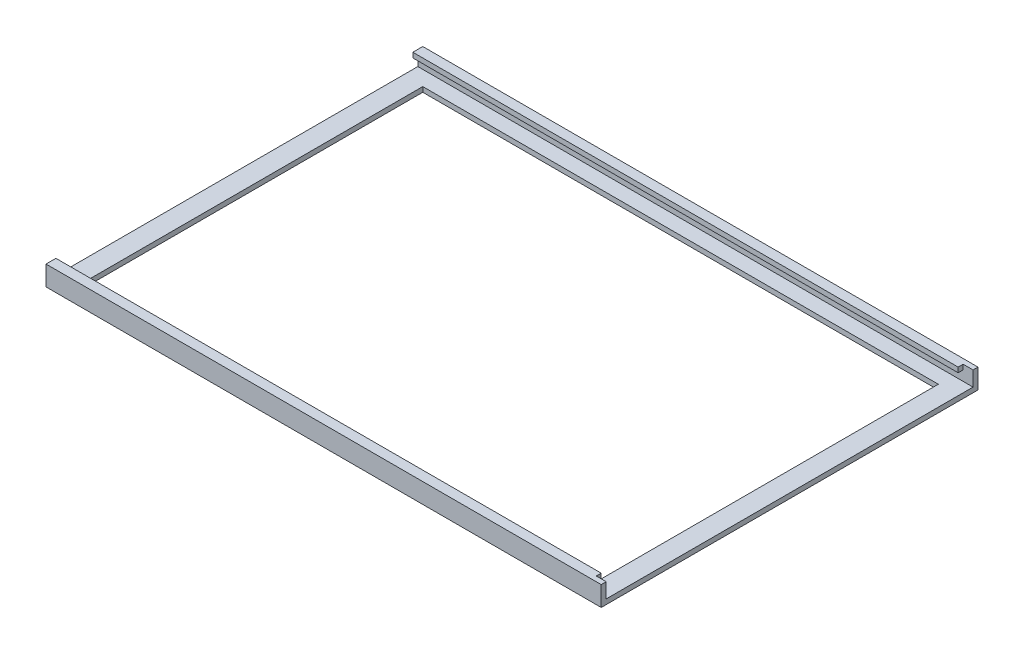
ISO-10303-21;
HEADER;
FILE_DESCRIPTION(('STEP AP214'),'2;1');
FILE_NAME('part.step','',(''),(''),'','','');
FILE_SCHEMA(('AUTOMOTIVE_DESIGN { 1 0 10303 214 1 1 1 1 }'));
ENDSEC;
DATA;
#1=APPLICATION_CONTEXT('core data for automotive mechanical design processes');
#2=APPLICATION_PROTOCOL_DEFINITION('international standard','automotive_design',2000,#1);
#3=PRODUCT_CONTEXT('',#1,'mechanical');
#4=PRODUCT('Part','Part','',(#3));
#5=PRODUCT_RELATED_PRODUCT_CATEGORY('part','',(#4));
#6=PRODUCT_DEFINITION_FORMATION('','',#4);
#7=PRODUCT_DEFINITION_CONTEXT('part definition',#1,'design');
#8=PRODUCT_DEFINITION('design','',#6,#7);
#9=PRODUCT_DEFINITION_SHAPE('','',#8);
#10=(LENGTH_UNIT() NAMED_UNIT(*) SI_UNIT(.MILLI.,.METRE.));
#11=(NAMED_UNIT(*) PLANE_ANGLE_UNIT() SI_UNIT($,.RADIAN.));
#12=(NAMED_UNIT(*) SI_UNIT($,.STERADIAN.) SOLID_ANGLE_UNIT());
#13=UNCERTAINTY_MEASURE_WITH_UNIT(LENGTH_MEASURE(1.E-05),#10,'distance_accuracy_value','');
#14=(GEOMETRIC_REPRESENTATION_CONTEXT(3) GLOBAL_UNCERTAINTY_ASSIGNED_CONTEXT((#13)) GLOBAL_UNIT_ASSIGNED_CONTEXT((#10,
#11,#12)) REPRESENTATION_CONTEXT('',''));
#15=CARTESIAN_POINT('',(0.,0.,0.));
#16=DIRECTION('',(0.,0.,1.));
#17=DIRECTION('',(1.,0.,0.));
#18=AXIS2_PLACEMENT_3D('',#15,#16,#17);
#19=CARTESIAN_POINT('',(112.,4.,-75.));
#20=DIRECTION('',(0.,0.,1.));
#21=DIRECTION('',(1.,0.,0.));
#22=AXIS2_PLACEMENT_3D('',#19,#20,#21);
#23=PLANE('',#22);
#24=DIRECTION('',(0.,1.,0.));
#25=VECTOR('',#24,1.);
#26=CARTESIAN_POINT('',(110.,3.,-75.));
#27=LINE('',#26,#25);
#28=CARTESIAN_POINT('',(110.,3.,-75.));
#29=VERTEX_POINT('',#28);
#30=CARTESIAN_POINT('',(110.,4.,-75.));
#31=VERTEX_POINT('',#30);
#32=EDGE_CURVE('E79',#29,#31,#27,.T.);
#33=ORIENTED_EDGE('',*,*,#32,.F.);
#34=DIRECTION('',(1.,0.,0.));
#35=VECTOR('',#34,1.);
#36=CARTESIAN_POINT('',(0.,3.,-75.));
#37=LINE('',#36,#35);
#38=CARTESIAN_POINT('',(0.,3.,-75.));
#39=VERTEX_POINT('',#38);
#40=EDGE_CURVE('E83',#39,#29,#37,.T.);
#41=ORIENTED_EDGE('',*,*,#40,.F.);
#42=DIRECTION('',(0.,-1.,0.));
#43=VECTOR('',#42,1.);
#44=CARTESIAN_POINT('',(0.,4.,-75.));
#45=LINE('',#44,#43);
#46=CARTESIAN_POINT('',(0.,1.,-75.));
#47=VERTEX_POINT('',#46);
#48=EDGE_CURVE('E263',#39,#47,#45,.T.);
#49=ORIENTED_EDGE('',*,*,#48,.T.);
#50=DIRECTION('',(-1.,0.,0.));
#51=VECTOR('',#50,1.);
#52=CARTESIAN_POINT('',(112.,1.,-75.));
#53=LINE('',#52,#51);
#54=CARTESIAN_POINT('',(112.,1.,-75.));
#55=VERTEX_POINT('',#54);
#56=EDGE_CURVE('E277',#55,#47,#53,.T.);
#57=ORIENTED_EDGE('',*,*,#56,.F.);
#58=DIRECTION('',(0.,-1.,0.));
#59=VECTOR('',#58,1.);
#60=CARTESIAN_POINT('',(112.,4.,-75.));
#61=LINE('',#60,#59);
#62=CARTESIAN_POINT('',(112.,4.,-75.));
#63=VERTEX_POINT('',#62);
#64=EDGE_CURVE('E271',#63,#55,#61,.T.);
#65=ORIENTED_EDGE('',*,*,#64,.F.);
#66=DIRECTION('',(-1.,0.,0.));
#67=VECTOR('',#66,1.);
#68=CARTESIAN_POINT('',(112.,4.,-75.));
#69=LINE('',#68,#67);
#70=EDGE_CURVE('E199',#63,#31,#69,.T.);
#71=ORIENTED_EDGE('',*,*,#70,.T.);
#72=EDGE_LOOP('',(#33,#41,#49,#57,#65,#71));
#73=FACE_BOUND('',#72,.T.);
#74=ADVANCED_FACE('F63',(#73),#23,.T.);
#75=CARTESIAN_POINT('',(0.,1.,0.));
#76=DIRECTION('',(0.,1.,0.));
#77=DIRECTION('',(0.,0.,1.));
#78=AXIS2_PLACEMENT_3D('',#75,#76,#77);
#79=PLANE('',#78);
#80=ORIENTED_EDGE('',*,*,#56,.T.);
#81=DIRECTION('',(0.,0.,1.));
#82=VECTOR('',#81,1.);
#83=CARTESIAN_POINT('',(0.,1.,-76.));
#84=LINE('',#83,#82);
#85=CARTESIAN_POINT('',(0.,1.,-1.));
#86=VERTEX_POINT('',#85);
#87=EDGE_CURVE('E358',#47,#86,#84,.T.);
#88=ORIENTED_EDGE('',*,*,#87,.T.);
#89=DIRECTION('',(1.,0.,0.));
#90=VECTOR('',#89,1.);
#91=CARTESIAN_POINT('',(0.,1.,-1.));
#92=LINE('',#91,#90);
#93=CARTESIAN_POINT('',(112.,1.,-1.));
#94=VERTEX_POINT('',#93);
#95=EDGE_CURVE('E281',#86,#94,#92,.T.);
#96=ORIENTED_EDGE('',*,*,#95,.T.);
#97=DIRECTION('',(0.,0.,-1.));
#98=VECTOR('',#97,1.);
#99=CARTESIAN_POINT('',(112.,1.,0.));
#100=LINE('',#99,#98);
#101=EDGE_CURVE('E362',#94,#55,#100,.T.);
#102=ORIENTED_EDGE('',*,*,#101,.T.);
#103=EDGE_LOOP('',(#80,#88,#96,#102));
#104=FACE_BOUND('',#103,.T.);
#105=DIRECTION('',(-1.,0.,0.));
#106=VECTOR('',#105,1.);
#107=CARTESIAN_POINT('',(108.,1.,-4.));
#108=LINE('',#107,#106);
#109=CARTESIAN_POINT('',(108.,1.,-4.));
#110=VERTEX_POINT('',#109);
#111=CARTESIAN_POINT('',(4.,1.,-3.99999999999999));
#112=VERTEX_POINT('',#111);
#113=EDGE_CURVE('E314',#110,#112,#108,.T.);
#114=ORIENTED_EDGE('',*,*,#113,.T.);
#115=DIRECTION('',(0.,0.,-1.));
#116=VECTOR('',#115,1.);
#117=CARTESIAN_POINT('',(4.,1.,-3.99999999999999));
#118=LINE('',#117,#116);
#119=CARTESIAN_POINT('',(4.00000000000001,1.,-72.));
#120=VERTEX_POINT('',#119);
#121=EDGE_CURVE('E318',#112,#120,#118,.T.);
#122=ORIENTED_EDGE('',*,*,#121,.T.);
#123=DIRECTION('',(1.,0.,0.));
#124=VECTOR('',#123,1.);
#125=CARTESIAN_POINT('',(4.00000000000001,1.,-72.));
#126=LINE('',#125,#124);
#127=CARTESIAN_POINT('',(108.,1.,-72.));
#128=VERTEX_POINT('',#127);
#129=EDGE_CURVE('E323',#120,#128,#126,.T.);
#130=ORIENTED_EDGE('',*,*,#129,.T.);
#131=DIRECTION('',(0.,0.,1.));
#132=VECTOR('',#131,1.);
#133=CARTESIAN_POINT('',(108.,1.,-72.));
#134=LINE('',#133,#132);
#135=EDGE_CURVE('E327',#128,#110,#134,.T.);
#136=ORIENTED_EDGE('',*,*,#135,.T.);
#137=EDGE_LOOP('',(#114,#122,#130,#136));
#138=FACE_BOUND('',#137,.T.);
#139=ADVANCED_FACE('F399',(#104,#138),#79,.T.);
#140=CARTESIAN_POINT('',(112.,1.,-76.));
#141=DIRECTION('',(0.,0.,1.));
#142=DIRECTION('',(1.,0.,0.));
#143=AXIS2_PLACEMENT_3D('',#140,#141,#142);
#144=PLANE('',#143);
#145=DIRECTION('',(-1.,0.,0.));
#146=VECTOR('',#145,1.);
#147=CARTESIAN_POINT('',(112.,0.,-76.));
#148=LINE('',#147,#146);
#149=CARTESIAN_POINT('',(112.,0.,-76.));
#150=VERTEX_POINT('',#149);
#151=CARTESIAN_POINT('',(0.,0.,-76.));
#152=VERTEX_POINT('',#151);
#153=EDGE_CURVE('E348',#150,#152,#148,.T.);
#154=ORIENTED_EDGE('',*,*,#153,.T.);
#155=DIRECTION('',(0.,-1.,0.));
#156=VECTOR('',#155,1.);
#157=CARTESIAN_POINT('',(0.,1.,-76.));
#158=LINE('',#157,#156);
#159=CARTESIAN_POINT('',(0.,4.,-76.));
#160=VERTEX_POINT('',#159);
#161=EDGE_CURVE('E12',#160,#152,#158,.T.);
#162=ORIENTED_EDGE('',*,*,#161,.F.);
#163=DIRECTION('',(1.,0.,0.));
#164=VECTOR('',#163,1.);
#165=CARTESIAN_POINT('',(0.,4.,-76.));
#166=LINE('',#165,#164);
#167=CARTESIAN_POINT('',(112.,4.,-76.));
#168=VERTEX_POINT('',#167);
#169=EDGE_CURVE('E196',#160,#168,#166,.T.);
#170=ORIENTED_EDGE('',*,*,#169,.T.);
#171=DIRECTION('',(0.,-1.,0.));
#172=VECTOR('',#171,1.);
#173=CARTESIAN_POINT('',(112.,1.,-76.));
#174=LINE('',#173,#172);
#175=EDGE_CURVE('E366',#168,#150,#174,.T.);
#176=ORIENTED_EDGE('',*,*,#175,.T.);
#177=EDGE_LOOP('',(#154,#162,#170,#176));
#178=FACE_BOUND('',#177,.T.);
#179=ADVANCED_FACE('F65',(#178),#144,.F.);
#180=CARTESIAN_POINT('',(0.,1.,-76.));
#181=DIRECTION('',(1.,0.,0.));
#182=DIRECTION('',(0.,0.,-1.));
#183=AXIS2_PLACEMENT_3D('',#180,#181,#182);
#184=PLANE('',#183);
#185=DIRECTION('',(0.,0.,1.));
#186=VECTOR('',#185,1.);
#187=CARTESIAN_POINT('',(0.,0.,-76.));
#188=LINE('',#187,#186);
#189=CARTESIAN_POINT('',(0.,0.,0.));
#190=VERTEX_POINT('',#189);
#191=EDGE_CURVE('E370',#152,#190,#188,.T.);
#192=ORIENTED_EDGE('',*,*,#191,.T.);
#193=DIRECTION('',(0.,-1.,0.));
#194=VECTOR('',#193,1.);
#195=CARTESIAN_POINT('',(0.,1.,0.));
#196=LINE('',#195,#194);
#197=CARTESIAN_POINT('',(0.,4.,0.));
#198=VERTEX_POINT('',#197);
#199=EDGE_CURVE('E72',#198,#190,#196,.T.);
#200=ORIENTED_EDGE('',*,*,#199,.F.);
#201=DIRECTION('',(0.,0.,-1.));
#202=VECTOR('',#201,1.);
#203=CARTESIAN_POINT('',(0.,4.,0.));
#204=LINE('',#203,#202);
#205=CARTESIAN_POINT('',(0.,4.,-2.));
#206=VERTEX_POINT('',#205);
#207=EDGE_CURVE('E290',#198,#206,#204,.T.);
#208=ORIENTED_EDGE('',*,*,#207,.T.);
#209=DIRECTION('',(0.,-1.,0.));
#210=VECTOR('',#209,1.);
#211=CARTESIAN_POINT('',(0.,4.,-2.));
#212=LINE('',#211,#210);
#213=CARTESIAN_POINT('',(0.,3.00000000000001,-2.));
#214=VERTEX_POINT('',#213);
#215=EDGE_CURVE('E236',#206,#214,#212,.T.);
#216=ORIENTED_EDGE('',*,*,#215,.T.);
#217=DIRECTION('',(0.,0.,1.));
#218=VECTOR('',#217,1.);
#219=CARTESIAN_POINT('',(0.,3.00000000000001,-2.));
#220=LINE('',#219,#218);
#221=CARTESIAN_POINT('',(0.,3.00000000000001,-1.));
#222=VERTEX_POINT('',#221);
#223=EDGE_CURVE('E253',#214,#222,#220,.T.);
#224=ORIENTED_EDGE('',*,*,#223,.T.);
#225=DIRECTION('',(0.,-1.,0.));
#226=VECTOR('',#225,1.);
#227=CARTESIAN_POINT('',(0.,4.,-1.));
#228=LINE('',#227,#226);
#229=EDGE_CURVE('E304',#222,#86,#228,.T.);
#230=ORIENTED_EDGE('',*,*,#229,.T.);
#231=ORIENTED_EDGE('',*,*,#87,.F.);
#232=ORIENTED_EDGE('',*,*,#48,.F.);
#233=DIRECTION('',(0.,0.,-1.));
#234=VECTOR('',#233,1.);
#235=CARTESIAN_POINT('',(0.,3.,-74.));
#236=LINE('',#235,#234);
#237=CARTESIAN_POINT('',(0.,3.,-74.));
#238=VERTEX_POINT('',#237);
#239=EDGE_CURVE('E205',#238,#39,#236,.T.);
#240=ORIENTED_EDGE('',*,*,#239,.F.);
#241=DIRECTION('',(0.,-1.,0.));
#242=VECTOR('',#241,1.);
#243=CARTESIAN_POINT('',(0.,4.,-74.));
#244=LINE('',#243,#242);
#245=CARTESIAN_POINT('',(0.,4.,-74.));
#246=VERTEX_POINT('',#245);
#247=EDGE_CURVE('E202',#246,#238,#244,.T.);
#248=ORIENTED_EDGE('',*,*,#247,.F.);
#249=DIRECTION('',(0.,0.,-1.));
#250=VECTOR('',#249,1.);
#251=CARTESIAN_POINT('',(0.,4.,-75.));
#252=LINE('',#251,#250);
#253=EDGE_CURVE('E188',#246,#160,#252,.T.);
#254=ORIENTED_EDGE('',*,*,#253,.T.);
#255=ORIENTED_EDGE('',*,*,#161,.T.);
#256=EDGE_LOOP('',(#192,#200,#208,#216,#224,#230,#231,#232,#240,#248,#254,#255));
#257=FACE_BOUND('',#256,.T.);
#258=ADVANCED_FACE('F203',(#257),#184,.F.);
#259=CARTESIAN_POINT('',(0.,1.,0.));
#260=DIRECTION('',(0.,0.,-1.));
#261=DIRECTION('',(-1.,0.,0.));
#262=AXIS2_PLACEMENT_3D('',#259,#260,#261);
#263=PLANE('',#262);
#264=DIRECTION('',(1.,0.,0.));
#265=VECTOR('',#264,1.);
#266=CARTESIAN_POINT('',(0.,0.,0.));
#267=LINE('',#266,#265);
#268=CARTESIAN_POINT('',(112.,0.,0.));
#269=VERTEX_POINT('',#268);
#270=EDGE_CURVE('E373',#190,#269,#267,.T.);
#271=ORIENTED_EDGE('',*,*,#270,.T.);
#272=DIRECTION('',(0.,-1.,0.));
#273=VECTOR('',#272,1.);
#274=CARTESIAN_POINT('',(112.,1.,0.));
#275=LINE('',#274,#273);
#276=CARTESIAN_POINT('',(112.,4.,0.));
#277=VERTEX_POINT('',#276);
#278=EDGE_CURVE('E381',#277,#269,#275,.T.);
#279=ORIENTED_EDGE('',*,*,#278,.F.);
#280=DIRECTION('',(-1.,0.,0.));
#281=VECTOR('',#280,1.);
#282=CARTESIAN_POINT('',(112.,4.,0.));
#283=LINE('',#282,#281);
#284=EDGE_CURVE('E300',#277,#198,#283,.T.);
#285=ORIENTED_EDGE('',*,*,#284,.T.);
#286=ORIENTED_EDGE('',*,*,#199,.T.);
#287=EDGE_LOOP('',(#271,#279,#285,#286));
#288=FACE_BOUND('',#287,.T.);
#289=ADVANCED_FACE('F388',(#288),#263,.F.);
#290=CARTESIAN_POINT('',(112.,1.,0.));
#291=DIRECTION('',(-1.,0.,0.));
#292=DIRECTION('',(0.,0.,1.));
#293=AXIS2_PLACEMENT_3D('',#290,#291,#292);
#294=PLANE('',#293);
#295=DIRECTION('',(0.,0.,-1.));
#296=VECTOR('',#295,1.);
#297=CARTESIAN_POINT('',(112.,0.,0.));
#298=LINE('',#297,#296);
#299=EDGE_CURVE('E363',#269,#150,#298,.T.);
#300=ORIENTED_EDGE('',*,*,#299,.T.);
#301=ORIENTED_EDGE('',*,*,#175,.F.);
#302=DIRECTION('',(0.,0.,1.));
#303=VECTOR('',#302,1.);
#304=CARTESIAN_POINT('',(112.,4.,-76.));
#305=LINE('',#304,#303);
#306=EDGE_CURVE('E282',#168,#63,#305,.T.);
#307=ORIENTED_EDGE('',*,*,#306,.T.);
#308=ORIENTED_EDGE('',*,*,#64,.T.);
#309=ORIENTED_EDGE('',*,*,#101,.F.);
#310=DIRECTION('',(0.,-1.,0.));
#311=VECTOR('',#310,1.);
#312=CARTESIAN_POINT('',(112.,4.,-1.));
#313=LINE('',#312,#311);
#314=CARTESIAN_POINT('',(112.,4.,-1.));
#315=VERTEX_POINT('',#314);
#316=EDGE_CURVE('E308',#315,#94,#313,.T.);
#317=ORIENTED_EDGE('',*,*,#316,.F.);
#318=DIRECTION('',(0.,0.,1.));
#319=VECTOR('',#318,1.);
#320=CARTESIAN_POINT('',(112.,4.,-1.));
#321=LINE('',#320,#319);
#322=EDGE_CURVE('E296',#315,#277,#321,.T.);
#323=ORIENTED_EDGE('',*,*,#322,.T.);
#324=ORIENTED_EDGE('',*,*,#278,.T.);
#325=EDGE_LOOP('',(#300,#301,#307,#308,#309,#317,#323,#324));
#326=FACE_BOUND('',#325,.T.);
#327=ADVANCED_FACE('F396',(#326),#294,.F.);
#328=CARTESIAN_POINT('',(0.,0.,0.));
#329=DIRECTION('',(0.,1.,0.));
#330=DIRECTION('',(0.,0.,1.));
#331=AXIS2_PLACEMENT_3D('',#328,#329,#330);
#332=PLANE('',#331);
#333=DIRECTION('',(0.,0.,-1.));
#334=VECTOR('',#333,1.);
#335=CARTESIAN_POINT('',(4.,0.,-3.99999999999999));
#336=LINE('',#335,#334);
#337=CARTESIAN_POINT('',(4.,0.,-3.99999999999999));
#338=VERTEX_POINT('',#337);
#339=CARTESIAN_POINT('',(4.00000000000001,0.,-72.));
#340=VERTEX_POINT('',#339);
#341=EDGE_CURVE('E334',#338,#340,#336,.T.);
#342=ORIENTED_EDGE('',*,*,#341,.F.);
#343=DIRECTION('',(-1.,0.,0.));
#344=VECTOR('',#343,1.);
#345=CARTESIAN_POINT('',(108.,0.,-4.));
#346=LINE('',#345,#344);
#347=CARTESIAN_POINT('',(108.,0.,-4.));
#348=VERTEX_POINT('',#347);
#349=EDGE_CURVE('E311',#348,#338,#346,.T.);
#350=ORIENTED_EDGE('',*,*,#349,.F.);
#351=DIRECTION('',(0.,0.,1.));
#352=VECTOR('',#351,1.);
#353=CARTESIAN_POINT('',(108.,0.,-72.));
#354=LINE('',#353,#352);
#355=CARTESIAN_POINT('',(108.,0.,-72.));
#356=VERTEX_POINT('',#355);
#357=EDGE_CURVE('E319',#356,#348,#354,.T.);
#358=ORIENTED_EDGE('',*,*,#357,.F.);
#359=DIRECTION('',(1.,0.,0.));
#360=VECTOR('',#359,1.);
#361=CARTESIAN_POINT('',(4.00000000000001,0.,-72.));
#362=LINE('',#361,#360);
#363=EDGE_CURVE('E338',#340,#356,#362,.T.);
#364=ORIENTED_EDGE('',*,*,#363,.F.);
#365=EDGE_LOOP('',(#342,#350,#358,#364));
#366=FACE_BOUND('',#365,.T.);
#367=ORIENTED_EDGE('',*,*,#153,.F.);
#368=ORIENTED_EDGE('',*,*,#299,.F.);
#369=ORIENTED_EDGE('',*,*,#270,.F.);
#370=ORIENTED_EDGE('',*,*,#191,.F.);
#371=EDGE_LOOP('',(#367,#368,#369,#370));
#372=FACE_BOUND('',#371,.T.);
#373=ADVANCED_FACE('F394',(#366,#372),#332,.F.);
#374=CARTESIAN_POINT('',(108.,1.,-4.));
#375=DIRECTION('',(0.,0.,1.));
#376=DIRECTION('',(1.,0.,0.));
#377=AXIS2_PLACEMENT_3D('',#374,#375,#376);
#378=PLANE('',#377);
#379=ORIENTED_EDGE('',*,*,#349,.T.);
#380=DIRECTION('',(0.,-1.,0.));
#381=VECTOR('',#380,1.);
#382=CARTESIAN_POINT('',(4.,1.,-3.99999999999999));
#383=LINE('',#382,#381);
#384=EDGE_CURVE('E331',#112,#338,#383,.T.);
#385=ORIENTED_EDGE('',*,*,#384,.F.);
#386=ORIENTED_EDGE('',*,*,#113,.F.);
#387=DIRECTION('',(0.,-1.,0.));
#388=VECTOR('',#387,1.);
#389=CARTESIAN_POINT('',(108.,1.,-4.));
#390=LINE('',#389,#388);
#391=EDGE_CURVE('E345',#110,#348,#390,.T.);
#392=ORIENTED_EDGE('',*,*,#391,.T.);
#393=EDGE_LOOP('',(#379,#385,#386,#392));
#394=FACE_BOUND('',#393,.T.);
#395=ADVANCED_FACE('F430',(#394),#378,.F.);
#396=CARTESIAN_POINT('',(108.,1.,-72.));
#397=DIRECTION('',(1.,0.,0.));
#398=DIRECTION('',(0.,0.,-1.));
#399=AXIS2_PLACEMENT_3D('',#396,#397,#398);
#400=PLANE('',#399);
#401=ORIENTED_EDGE('',*,*,#357,.T.);
#402=ORIENTED_EDGE('',*,*,#391,.F.);
#403=ORIENTED_EDGE('',*,*,#135,.F.);
#404=DIRECTION('',(0.,-1.,0.));
#405=VECTOR('',#404,1.);
#406=CARTESIAN_POINT('',(108.,1.,-72.));
#407=LINE('',#406,#405);
#408=EDGE_CURVE('E349',#128,#356,#407,.T.);
#409=ORIENTED_EDGE('',*,*,#408,.T.);
#410=EDGE_LOOP('',(#401,#402,#403,#409));
#411=FACE_BOUND('',#410,.T.);
#412=ADVANCED_FACE('F426',(#411),#400,.F.);
#413=CARTESIAN_POINT('',(4.00000000000001,1.,-72.));
#414=DIRECTION('',(0.,0.,-1.));
#415=DIRECTION('',(-1.,0.,0.));
#416=AXIS2_PLACEMENT_3D('',#413,#414,#415);
#417=PLANE('',#416);
#418=ORIENTED_EDGE('',*,*,#363,.T.);
#419=ORIENTED_EDGE('',*,*,#408,.F.);
#420=ORIENTED_EDGE('',*,*,#129,.F.);
#421=DIRECTION('',(0.,-1.,0.));
#422=VECTOR('',#421,1.);
#423=CARTESIAN_POINT('',(4.00000000000001,1.,-72.));
#424=LINE('',#423,#422);
#425=EDGE_CURVE('E352',#120,#340,#424,.T.);
#426=ORIENTED_EDGE('',*,*,#425,.T.);
#427=EDGE_LOOP('',(#418,#419,#420,#426));
#428=FACE_BOUND('',#427,.T.);
#429=ADVANCED_FACE('F429',(#428),#417,.F.);
#430=CARTESIAN_POINT('',(4.,1.,-3.99999999999999));
#431=DIRECTION('',(-1.,0.,0.));
#432=DIRECTION('',(0.,0.,1.));
#433=AXIS2_PLACEMENT_3D('',#430,#431,#432);
#434=PLANE('',#433);
#435=ORIENTED_EDGE('',*,*,#341,.T.);
#436=ORIENTED_EDGE('',*,*,#425,.F.);
#437=ORIENTED_EDGE('',*,*,#121,.F.);
#438=ORIENTED_EDGE('',*,*,#384,.T.);
#439=EDGE_LOOP('',(#435,#436,#437,#438));
#440=FACE_BOUND('',#439,.T.);
#441=ADVANCED_FACE('F424',(#440),#434,.F.);
#442=CARTESIAN_POINT('',(0.,4.,-1.));
#443=DIRECTION('',(0.,0.,-1.));
#444=DIRECTION('',(-1.,0.,0.));
#445=AXIS2_PLACEMENT_3D('',#442,#443,#444);
#446=PLANE('',#445);
#447=DIRECTION('',(0.,1.,0.));
#448=VECTOR('',#447,1.);
#449=CARTESIAN_POINT('',(110.,3.,-1.));
#450=LINE('',#449,#448);
#451=CARTESIAN_POINT('',(110.,3.,-1.));
#452=VERTEX_POINT('',#451);
#453=CARTESIAN_POINT('',(110.,4.,-1.));
#454=VERTEX_POINT('',#453);
#455=EDGE_CURVE('E241',#452,#454,#450,.T.);
#456=ORIENTED_EDGE('',*,*,#455,.T.);
#457=DIRECTION('',(1.,0.,0.));
#458=VECTOR('',#457,1.);
#459=CARTESIAN_POINT('',(0.,4.,-1.));
#460=LINE('',#459,#458);
#461=EDGE_CURVE('E293',#454,#315,#460,.T.);
#462=ORIENTED_EDGE('',*,*,#461,.T.);
#463=ORIENTED_EDGE('',*,*,#316,.T.);
#464=ORIENTED_EDGE('',*,*,#95,.F.);
#465=ORIENTED_EDGE('',*,*,#229,.F.);
#466=DIRECTION('',(1.,0.,0.));
#467=VECTOR('',#466,1.);
#468=CARTESIAN_POINT('',(0.,3.00000000000001,-1.));
#469=LINE('',#468,#467);
#470=EDGE_CURVE('E235',#222,#452,#469,.T.);
#471=ORIENTED_EDGE('',*,*,#470,.T.);
#472=EDGE_LOOP('',(#456,#462,#463,#464,#465,#471));
#473=FACE_BOUND('',#472,.T.);
#474=ADVANCED_FACE('F420',(#473),#446,.T.);
#475=CARTESIAN_POINT('',(0.,4.,0.));
#476=DIRECTION('',(0.,-1.,0.));
#477=DIRECTION('',(0.,0.,-1.));
#478=AXIS2_PLACEMENT_3D('',#475,#476,#477);
#479=PLANE('',#478);
#480=ORIENTED_EDGE('',*,*,#207,.F.);
#481=ORIENTED_EDGE('',*,*,#284,.F.);
#482=ORIENTED_EDGE('',*,*,#322,.F.);
#483=ORIENTED_EDGE('',*,*,#461,.F.);
#484=DIRECTION('',(0.,0.,1.));
#485=VECTOR('',#484,1.);
#486=CARTESIAN_POINT('',(110.,4.,-2.));
#487=LINE('',#486,#485);
#488=CARTESIAN_POINT('',(110.,4.,-2.));
#489=VERTEX_POINT('',#488);
#490=EDGE_CURVE('E259',#489,#454,#487,.T.);
#491=ORIENTED_EDGE('',*,*,#490,.F.);
#492=DIRECTION('',(-1.,0.,0.));
#493=VECTOR('',#492,1.);
#494=CARTESIAN_POINT('',(110.,4.,-2.));
#495=LINE('',#494,#493);
#496=EDGE_CURVE('E249',#489,#206,#495,.T.);
#497=ORIENTED_EDGE('',*,*,#496,.T.);
#498=EDGE_LOOP('',(#480,#481,#482,#483,#491,#497));
#499=FACE_BOUND('',#498,.T.);
#500=ADVANCED_FACE('F417',(#499),#479,.F.);
#501=CARTESIAN_POINT('',(0.,4.,0.));
#502=DIRECTION('',(0.,-1.,0.));
#503=DIRECTION('',(0.,0.,-1.));
#504=AXIS2_PLACEMENT_3D('',#501,#502,#503);
#505=PLANE('',#504);
#506=ORIENTED_EDGE('',*,*,#306,.F.);
#507=ORIENTED_EDGE('',*,*,#169,.F.);
#508=ORIENTED_EDGE('',*,*,#253,.F.);
#509=DIRECTION('',(-1.,0.,0.));
#510=VECTOR('',#509,1.);
#511=CARTESIAN_POINT('',(110.,4.,-74.));
#512=LINE('',#511,#510);
#513=CARTESIAN_POINT('',(110.,4.,-74.));
#514=VERTEX_POINT('',#513);
#515=EDGE_CURVE('E194',#514,#246,#512,.T.);
#516=ORIENTED_EDGE('',*,*,#515,.F.);
#517=DIRECTION('',(0.,0.,-1.));
#518=VECTOR('',#517,1.);
#519=CARTESIAN_POINT('',(110.,4.,-74.));
#520=LINE('',#519,#518);
#521=EDGE_CURVE('E224',#514,#31,#520,.T.);
#522=ORIENTED_EDGE('',*,*,#521,.T.);
#523=ORIENTED_EDGE('',*,*,#70,.F.);
#524=EDGE_LOOP('',(#506,#507,#508,#516,#522,#523));
#525=FACE_BOUND('',#524,.T.);
#526=ADVANCED_FACE('F191',(#525),#505,.F.);
#527=CARTESIAN_POINT('',(110.,3.,-2.));
#528=DIRECTION('',(1.,0.,0.));
#529=DIRECTION('',(0.,0.,-1.));
#530=AXIS2_PLACEMENT_3D('',#527,#528,#529);
#531=PLANE('',#530);
#532=ORIENTED_EDGE('',*,*,#455,.F.);
#533=DIRECTION('',(0.,0.,1.));
#534=VECTOR('',#533,1.);
#535=CARTESIAN_POINT('',(110.,3.,-2.));
#536=LINE('',#535,#534);
#537=CARTESIAN_POINT('',(110.,3.,-2.));
#538=VERTEX_POINT('',#537);
#539=EDGE_CURVE('E264',#538,#452,#536,.T.);
#540=ORIENTED_EDGE('',*,*,#539,.F.);
#541=DIRECTION('',(0.,1.,0.));
#542=VECTOR('',#541,1.);
#543=CARTESIAN_POINT('',(110.,3.,-2.));
#544=LINE('',#543,#542);
#545=EDGE_CURVE('E245',#538,#489,#544,.T.);
#546=ORIENTED_EDGE('',*,*,#545,.T.);
#547=ORIENTED_EDGE('',*,*,#490,.T.);
#548=EDGE_LOOP('',(#532,#540,#546,#547));
#549=FACE_BOUND('',#548,.T.);
#550=ADVANCED_FACE('F416',(#549),#531,.T.);
#551=CARTESIAN_POINT('',(0.,3.00000000000001,-2.));
#552=DIRECTION('',(0.,-1.,0.));
#553=DIRECTION('',(1.,0.,0.));
#554=AXIS2_PLACEMENT_3D('',#551,#552,#553);
#555=PLANE('',#554);
#556=ORIENTED_EDGE('',*,*,#470,.F.);
#557=ORIENTED_EDGE('',*,*,#223,.F.);
#558=DIRECTION('',(1.,0.,0.));
#559=VECTOR('',#558,1.);
#560=CARTESIAN_POINT('',(0.,3.00000000000001,-2.));
#561=LINE('',#560,#559);
#562=EDGE_CURVE('E240',#214,#538,#561,.T.);
#563=ORIENTED_EDGE('',*,*,#562,.T.);
#564=ORIENTED_EDGE('',*,*,#539,.T.);
#565=EDGE_LOOP('',(#556,#557,#563,#564));
#566=FACE_BOUND('',#565,.T.);
#567=ADVANCED_FACE('F412',(#566),#555,.T.);
#568=CARTESIAN_POINT('',(0.,0.,-2.));
#569=DIRECTION('',(0.,0.,1.));
#570=DIRECTION('',(1.,0.,0.));
#571=AXIS2_PLACEMENT_3D('',#568,#569,#570);
#572=PLANE('',#571);
#573=ORIENTED_EDGE('',*,*,#215,.F.);
#574=ORIENTED_EDGE('',*,*,#496,.F.);
#575=ORIENTED_EDGE('',*,*,#545,.F.);
#576=ORIENTED_EDGE('',*,*,#562,.F.);
#577=EDGE_LOOP('',(#573,#574,#575,#576));
#578=FACE_BOUND('',#577,.T.);
#579=ADVANCED_FACE('F501',(#578),#572,.F.);
#580=CARTESIAN_POINT('',(0.,3.,-74.));
#581=DIRECTION('',(0.,1.,0.));
#582=DIRECTION('',(0.,0.,1.));
#583=AXIS2_PLACEMENT_3D('',#580,#581,#582);
#584=PLANE('',#583);
#585=ORIENTED_EDGE('',*,*,#40,.T.);
#586=DIRECTION('',(0.,0.,-1.));
#587=VECTOR('',#586,1.);
#588=CARTESIAN_POINT('',(110.,3.,-74.));
#589=LINE('',#588,#587);
#590=CARTESIAN_POINT('',(110.,3.,-74.));
#591=VERTEX_POINT('',#590);
#592=EDGE_CURVE('E229',#591,#29,#589,.T.);
#593=ORIENTED_EDGE('',*,*,#592,.F.);
#594=DIRECTION('',(1.,0.,0.));
#595=VECTOR('',#594,1.);
#596=CARTESIAN_POINT('',(0.,3.,-74.));
#597=LINE('',#596,#595);
#598=EDGE_CURVE('E209',#238,#591,#597,.T.);
#599=ORIENTED_EDGE('',*,*,#598,.F.);
#600=ORIENTED_EDGE('',*,*,#239,.T.);
#601=EDGE_LOOP('',(#585,#593,#599,#600));
#602=FACE_BOUND('',#601,.T.);
#603=ADVANCED_FACE('F508',(#602),#584,.F.);
#604=CARTESIAN_POINT('',(110.,3.,-74.));
#605=DIRECTION('',(-1.,0.,0.));
#606=DIRECTION('',(0.,0.,1.));
#607=AXIS2_PLACEMENT_3D('',#604,#605,#606);
#608=PLANE('',#607);
#609=ORIENTED_EDGE('',*,*,#32,.T.);
#610=ORIENTED_EDGE('',*,*,#521,.F.);
#611=DIRECTION('',(0.,1.,0.));
#612=VECTOR('',#611,1.);
#613=CARTESIAN_POINT('',(110.,3.,-74.));
#614=LINE('',#613,#612);
#615=EDGE_CURVE('E213',#591,#514,#614,.T.);
#616=ORIENTED_EDGE('',*,*,#615,.F.);
#617=ORIENTED_EDGE('',*,*,#592,.T.);
#618=EDGE_LOOP('',(#609,#610,#616,#617));
#619=FACE_BOUND('',#618,.T.);
#620=ADVANCED_FACE('F515',(#619),#608,.F.);
#621=CARTESIAN_POINT('',(0.,0.,-74.));
#622=DIRECTION('',(0.,0.,1.));
#623=DIRECTION('',(1.,0.,0.));
#624=AXIS2_PLACEMENT_3D('',#621,#622,#623);
#625=PLANE('',#624);
#626=ORIENTED_EDGE('',*,*,#515,.T.);
#627=ORIENTED_EDGE('',*,*,#247,.T.);
#628=ORIENTED_EDGE('',*,*,#598,.T.);
#629=ORIENTED_EDGE('',*,*,#615,.T.);
#630=EDGE_LOOP('',(#626,#627,#628,#629));
#631=FACE_BOUND('',#630,.T.);
#632=ADVANCED_FACE('F211',(#631),#625,.T.);
#633=CLOSED_SHELL('',(#74,#139,#179,#258,#289,#327,#373,#395,#412,#429,#441,#474,#500,#526,#550,
#567,#579,#603,#620,#632));
#634=MANIFOLD_SOLID_BREP('B2',#633);
#635=ADVANCED_BREP_SHAPE_REPRESENTATION('',(#18,#634),#14);
#636=SHAPE_DEFINITION_REPRESENTATION(#9,#635);
ENDSEC;
END-ISO-10303-21;
